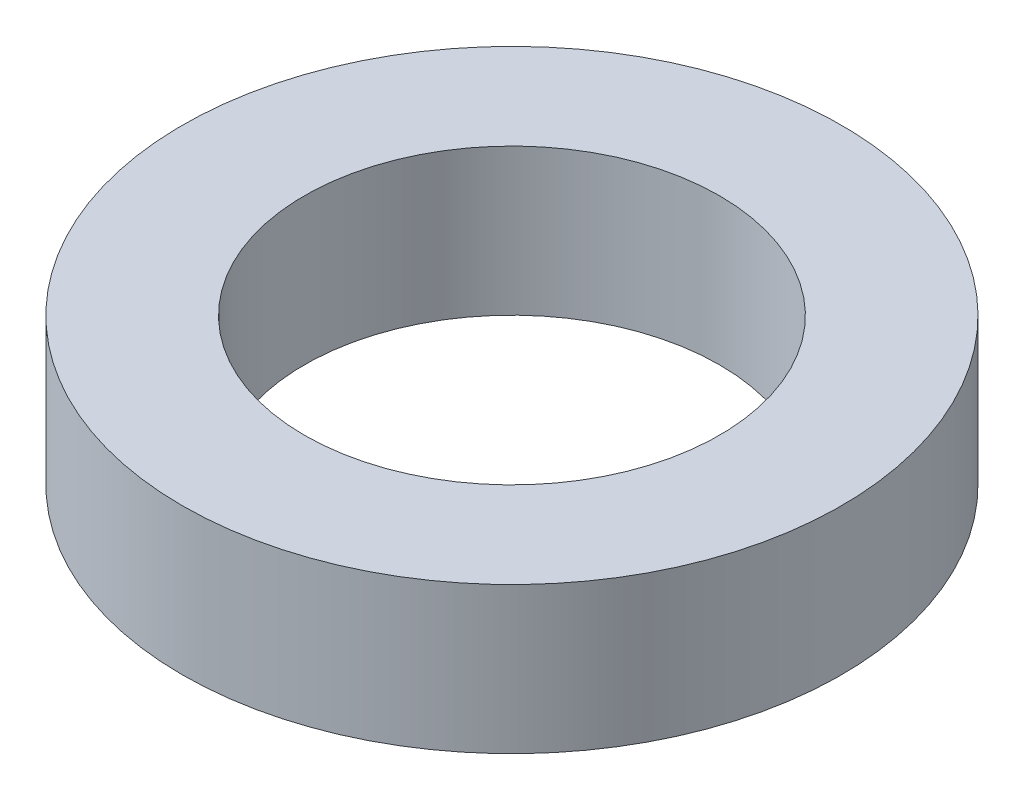
ISO-10303-21;
HEADER;
FILE_DESCRIPTION(('STEP AP214'),'2;1');
FILE_NAME('part.step','',(''),(''),'','','');
FILE_SCHEMA(('AUTOMOTIVE_DESIGN { 1 0 10303 214 1 1 1 1 }'));
ENDSEC;
DATA;
#1=APPLICATION_CONTEXT('core data for automotive mechanical design processes');
#2=APPLICATION_PROTOCOL_DEFINITION('international standard','automotive_design',2000,#1);
#3=PRODUCT_CONTEXT('',#1,'mechanical');
#4=PRODUCT('Part','Part','',(#3));
#5=PRODUCT_RELATED_PRODUCT_CATEGORY('part','',(#4));
#6=PRODUCT_DEFINITION_FORMATION('','',#4);
#7=PRODUCT_DEFINITION_CONTEXT('part definition',#1,'design');
#8=PRODUCT_DEFINITION('design','',#6,#7);
#9=PRODUCT_DEFINITION_SHAPE('','',#8);
#10=(LENGTH_UNIT() NAMED_UNIT(*) SI_UNIT(.MILLI.,.METRE.));
#11=(NAMED_UNIT(*) PLANE_ANGLE_UNIT() SI_UNIT($,.RADIAN.));
#12=(NAMED_UNIT(*) SI_UNIT($,.STERADIAN.) SOLID_ANGLE_UNIT());
#13=UNCERTAINTY_MEASURE_WITH_UNIT(LENGTH_MEASURE(1.E-05),#10,'distance_accuracy_value','');
#14=(GEOMETRIC_REPRESENTATION_CONTEXT(3) GLOBAL_UNCERTAINTY_ASSIGNED_CONTEXT((#13)) GLOBAL_UNIT_ASSIGNED_CONTEXT((#10,
#11,#12)) REPRESENTATION_CONTEXT('',''));
#15=CARTESIAN_POINT('',(0.,0.,0.));
#16=DIRECTION('',(0.,0.,1.));
#17=DIRECTION('',(1.,0.,0.));
#18=AXIS2_PLACEMENT_3D('',#15,#16,#17);
#19=CARTESIAN_POINT('',(0.,12.,0.));
#20=DIRECTION('',(0.,1.,0.));
#21=DIRECTION('',(0.,0.,1.));
#22=AXIS2_PLACEMENT_3D('',#19,#20,#21);
#23=PLANE('',#22);
#24=CARTESIAN_POINT('',(0.,12.,0.));
#25=DIRECTION('',(0.,1.,0.));
#26=DIRECTION('',(0.,0.,1.));
#27=AXIS2_PLACEMENT_3D('',#24,#25,#26);
#28=CIRCLE('',#27,27.);
#29=CARTESIAN_POINT('',(0.,12.,27.));
#30=VERTEX_POINT('',#29);
#31=EDGE_CURVE('E10',#30,#30,#28,.T.);
#32=ORIENTED_EDGE('',*,*,#31,.T.);
#33=EDGE_LOOP('',(#32));
#34=FACE_BOUND('',#33,.T.);
#35=CARTESIAN_POINT('',(0.,12.,0.));
#36=DIRECTION('',(0.,1.,0.));
#37=DIRECTION('',(0.,0.,1.));
#38=AXIS2_PLACEMENT_3D('',#35,#36,#37);
#39=CIRCLE('',#38,17.);
#40=CARTESIAN_POINT('',(0.,12.,17.));
#41=VERTEX_POINT('',#40);
#42=EDGE_CURVE('E50',#41,#41,#39,.T.);
#43=ORIENTED_EDGE('',*,*,#42,.F.);
#44=EDGE_LOOP('',(#43));
#45=FACE_BOUND('',#44,.T.);
#46=ADVANCED_FACE('F37',(#34,#45),#23,.T.);
#47=CARTESIAN_POINT('',(0.,0.,0.));
#48=DIRECTION('',(0.,1.,0.));
#49=DIRECTION('',(0.,0.,1.));
#50=AXIS2_PLACEMENT_3D('',#47,#48,#49);
#51=PLANE('',#50);
#52=CARTESIAN_POINT('',(0.,0.,0.));
#53=DIRECTION('',(0.,1.,0.));
#54=DIRECTION('',(0.,0.,1.));
#55=AXIS2_PLACEMENT_3D('',#52,#53,#54);
#56=CIRCLE('',#55,27.);
#57=CARTESIAN_POINT('',(0.,0.,27.));
#58=VERTEX_POINT('',#57);
#59=EDGE_CURVE('E41',#58,#58,#56,.T.);
#60=ORIENTED_EDGE('',*,*,#59,.F.);
#61=EDGE_LOOP('',(#60));
#62=FACE_BOUND('',#61,.T.);
#63=CARTESIAN_POINT('',(0.,0.,0.));
#64=DIRECTION('',(0.,1.,0.));
#65=DIRECTION('',(0.,0.,1.));
#66=AXIS2_PLACEMENT_3D('',#63,#64,#65);
#67=CIRCLE('',#66,17.);
#68=CARTESIAN_POINT('',(0.,0.,17.));
#69=VERTEX_POINT('',#68);
#70=EDGE_CURVE('E52',#69,#69,#67,.T.);
#71=ORIENTED_EDGE('',*,*,#70,.T.);
#72=EDGE_LOOP('',(#71));
#73=FACE_BOUND('',#72,.T.);
#74=ADVANCED_FACE('F64',(#62,#73),#51,.F.);
#75=CARTESIAN_POINT('',(0.,12.,0.));
#76=DIRECTION('',(0.,-1.,0.));
#77=DIRECTION('',(0.,0.,-1.));
#78=AXIS2_PLACEMENT_3D('',#75,#76,#77);
#79=CYLINDRICAL_SURFACE('',#78,27.);
#80=ORIENTED_EDGE('',*,*,#31,.F.);
#81=EDGE_LOOP('',(#80));
#82=FACE_BOUND('',#81,.T.);
#83=ORIENTED_EDGE('',*,*,#59,.T.);
#84=EDGE_LOOP('',(#83));
#85=FACE_BOUND('',#84,.T.);
#86=ADVANCED_FACE('F39',(#82,#85),#79,.T.);
#87=CARTESIAN_POINT('',(0.,12.,0.));
#88=DIRECTION('',(0.,-1.,0.));
#89=DIRECTION('',(0.,0.,-1.));
#90=AXIS2_PLACEMENT_3D('',#87,#88,#89);
#91=CYLINDRICAL_SURFACE('',#90,17.);
#92=ORIENTED_EDGE('',*,*,#42,.T.);
#93=EDGE_LOOP('',(#92));
#94=FACE_BOUND('',#93,.T.);
#95=ORIENTED_EDGE('',*,*,#70,.F.);
#96=EDGE_LOOP('',(#95));
#97=FACE_BOUND('',#96,.T.);
#98=ADVANCED_FACE('F60',(#94,#97),#91,.F.);
#99=CLOSED_SHELL('',(#46,#74,#86,#98));
#100=MANIFOLD_SOLID_BREP('B2',#99);
#101=ADVANCED_BREP_SHAPE_REPRESENTATION('',(#18,#100),#14);
#102=SHAPE_DEFINITION_REPRESENTATION(#9,#101);
ENDSEC;
END-ISO-10303-21;
